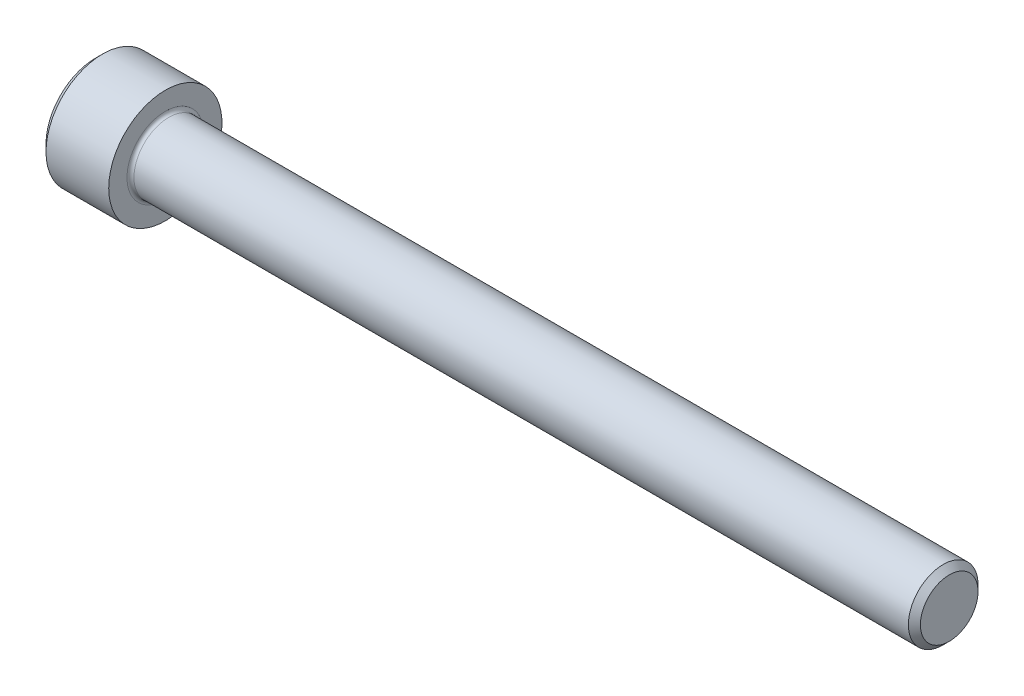
ISO-10303-21;
HEADER;
FILE_DESCRIPTION(('STEP AP214'),'2;1');
FILE_NAME('part.step','',(''),(''),'','','');
FILE_SCHEMA(('AUTOMOTIVE_DESIGN { 1 0 10303 214 1 1 1 1 }'));
ENDSEC;
DATA;
#1=APPLICATION_CONTEXT('core data for automotive mechanical design processes');
#2=APPLICATION_PROTOCOL_DEFINITION('international standard','automotive_design',2000,#1);
#3=PRODUCT_CONTEXT('',#1,'mechanical');
#4=PRODUCT('Part','Part','',(#3));
#5=PRODUCT_RELATED_PRODUCT_CATEGORY('part','',(#4));
#6=PRODUCT_DEFINITION_FORMATION('','',#4);
#7=PRODUCT_DEFINITION_CONTEXT('part definition',#1,'design');
#8=PRODUCT_DEFINITION('design','',#6,#7);
#9=PRODUCT_DEFINITION_SHAPE('','',#8);
#10=(LENGTH_UNIT() NAMED_UNIT(*) SI_UNIT(.MILLI.,.METRE.));
#11=(NAMED_UNIT(*) PLANE_ANGLE_UNIT() SI_UNIT($,.RADIAN.));
#12=(NAMED_UNIT(*) SI_UNIT($,.STERADIAN.) SOLID_ANGLE_UNIT());
#13=UNCERTAINTY_MEASURE_WITH_UNIT(LENGTH_MEASURE(1.E-05),#10,'distance_accuracy_value','');
#14=(GEOMETRIC_REPRESENTATION_CONTEXT(3) GLOBAL_UNCERTAINTY_ASSIGNED_CONTEXT((#13)) GLOBAL_UNIT_ASSIGNED_CONTEXT((#10,
#11,#12)) REPRESENTATION_CONTEXT('',''));
#15=CARTESIAN_POINT('',(0.,0.,0.));
#16=DIRECTION('',(0.,0.,1.));
#17=DIRECTION('',(1.,0.,0.));
#18=AXIS2_PLACEMENT_3D('',#15,#16,#17);
#19=CARTESIAN_POINT('',(0.,0.,0.));
#20=DIRECTION('',(-1.,0.,0.));
#21=DIRECTION('',(0.,0.,1.));
#22=AXIS2_PLACEMENT_3D('',#19,#20,#21);
#23=PLANE('',#22);
#24=DIRECTION('',(0.,-0.499999999999999,0.866025403784439));
#25=VECTOR('',#24,1.);
#26=CARTESIAN_POINT('',(0.,3.51894989071077,0.));
#27=LINE('',#26,#25);
#28=CARTESIAN_POINT('',(0.,3.51894989071077,0.));
#29=VERTEX_POINT('',#28);
#30=CARTESIAN_POINT('',(0.,1.75947494535539,3.0475));
#31=VERTEX_POINT('',#30);
#32=EDGE_CURVE('E274',#29,#31,#27,.T.);
#33=ORIENTED_EDGE('',*,*,#32,.T.);
#34=DIRECTION('',(0.,1.,0.));
#35=VECTOR('',#34,1.);
#36=CARTESIAN_POINT('',(0.,-1.75947494535538,3.0475));
#37=LINE('',#36,#35);
#38=CARTESIAN_POINT('',(0.,-1.75947494535538,3.0475));
#39=VERTEX_POINT('',#38);
#40=EDGE_CURVE('E131',#39,#31,#37,.T.);
#41=ORIENTED_EDGE('',*,*,#40,.F.);
#42=DIRECTION('',(0.,-0.500000000000001,-0.866025403784438));
#43=VECTOR('',#42,1.);
#44=CARTESIAN_POINT('',(0.,-1.75947494535538,3.0475));
#45=LINE('',#44,#43);
#46=CARTESIAN_POINT('',(0.,-3.51894989071077,0.));
#47=VERTEX_POINT('',#46);
#48=EDGE_CURVE('E280',#39,#47,#45,.T.);
#49=ORIENTED_EDGE('',*,*,#48,.T.);
#50=DIRECTION('',(0.,0.499999999999999,-0.866025403784439));
#51=VECTOR('',#50,1.);
#52=CARTESIAN_POINT('',(0.,-3.51894989071077,0.));
#53=LINE('',#52,#51);
#54=CARTESIAN_POINT('',(0.,-1.75947494535539,-3.0475));
#55=VERTEX_POINT('',#54);
#56=EDGE_CURVE('E277',#47,#55,#53,.T.);
#57=ORIENTED_EDGE('',*,*,#56,.T.);
#58=DIRECTION('',(0.,-1.,0.));
#59=VECTOR('',#58,1.);
#60=CARTESIAN_POINT('',(0.,1.75947494535538,-3.0475));
#61=LINE('',#60,#59);
#62=CARTESIAN_POINT('',(0.,1.75947494535538,-3.0475));
#63=VERTEX_POINT('',#62);
#64=EDGE_CURVE('E281',#63,#55,#61,.T.);
#65=ORIENTED_EDGE('',*,*,#64,.F.);
#66=DIRECTION('',(0.,-0.500000000000001,-0.866025403784438));
#67=VECTOR('',#66,1.);
#68=CARTESIAN_POINT('',(0.,3.51894989071077,0.));
#69=LINE('',#68,#67);
#70=EDGE_CURVE('E126',#29,#63,#69,.T.);
#71=ORIENTED_EDGE('',*,*,#70,.F.);
#72=EDGE_LOOP('',(#33,#41,#49,#57,#65,#71));
#73=FACE_BOUND('',#72,.T.);
#74=CARTESIAN_POINT('',(0.,0.,0.));
#75=DIRECTION('',(-1.,0.,0.));
#76=DIRECTION('',(0.,0.,1.));
#77=AXIS2_PLACEMENT_3D('',#74,#75,#76);
#78=CIRCLE('',#77,5.7);
#79=CARTESIAN_POINT('',(0.,0.,5.7));
#80=VERTEX_POINT('',#79);
#81=EDGE_CURVE('E160',#80,#80,#78,.T.);
#82=ORIENTED_EDGE('',*,*,#81,.T.);
#83=EDGE_LOOP('',(#82));
#84=FACE_BOUND('',#83,.T.);
#85=ADVANCED_FACE('F41',(#73,#84),#23,.T.);
#86=CARTESIAN_POINT('',(0.,0.,0.));
#87=DIRECTION('',(1.,0.,0.));
#88=DIRECTION('',(0.,0.,-1.));
#89=AXIS2_PLACEMENT_3D('',#86,#87,#88);
#90=CONICAL_SURFACE('',#89,5.7,0.785398163397448);
#91=CARTESIAN_POINT('',(0.800000000000002,0.,0.));
#92=DIRECTION('',(-1.,0.,0.));
#93=DIRECTION('',(0.,0.,1.));
#94=AXIS2_PLACEMENT_3D('',#91,#92,#93);
#95=CIRCLE('',#94,6.5);
#96=CARTESIAN_POINT('',(0.800000000000002,0.,6.5));
#97=VERTEX_POINT('',#96);
#98=EDGE_CURVE('E154',#97,#97,#95,.T.);
#99=ORIENTED_EDGE('',*,*,#98,.T.);
#100=EDGE_LOOP('',(#99));
#101=FACE_BOUND('',#100,.T.);
#102=ORIENTED_EDGE('',*,*,#81,.F.);
#103=EDGE_LOOP('',(#102));
#104=FACE_BOUND('',#103,.T.);
#105=ADVANCED_FACE('F177',(#101,#104),#90,.T.);
#106=CARTESIAN_POINT('',(-31.75,0.,0.));
#107=DIRECTION('',(-1.,0.,0.));
#108=DIRECTION('',(0.,0.,1.));
#109=AXIS2_PLACEMENT_3D('',#106,#107,#108);
#110=CYLINDRICAL_SURFACE('',#109,6.5);
#111=CARTESIAN_POINT('',(7.99999999999999,0.,0.));
#112=DIRECTION('',(-1.,0.,0.));
#113=DIRECTION('',(0.,0.,1.));
#114=AXIS2_PLACEMENT_3D('',#111,#112,#113);
#115=CIRCLE('',#114,6.5);
#116=CARTESIAN_POINT('',(7.99999999999999,0.,6.5));
#117=VERTEX_POINT('',#116);
#118=EDGE_CURVE('E153',#117,#117,#115,.T.);
#119=ORIENTED_EDGE('',*,*,#118,.T.);
#120=EDGE_LOOP('',(#119));
#121=FACE_BOUND('',#120,.T.);
#122=ORIENTED_EDGE('',*,*,#98,.F.);
#123=EDGE_LOOP('',(#122));
#124=FACE_BOUND('',#123,.T.);
#125=ADVANCED_FACE('F183',(#121,#124),#110,.T.);
#126=CARTESIAN_POINT('',(8.,6.5,0.));
#127=DIRECTION('',(1.,0.,0.));
#128=DIRECTION('',(0.,0.,-1.));
#129=AXIS2_PLACEMENT_3D('',#126,#127,#128);
#130=PLANE('',#129);
#131=CARTESIAN_POINT('',(8.,0.,0.));
#132=DIRECTION('',(1.,0.,0.));
#133=DIRECTION('',(0.,0.,-1.));
#134=AXIS2_PLACEMENT_3D('',#131,#132,#133);
#135=CIRCLE('',#134,4.40000000000003);
#136=CARTESIAN_POINT('',(8.,0.,-4.40000000000003));
#137=VERTEX_POINT('',#136);
#138=EDGE_CURVE('E47',#137,#137,#135,.F.);
#139=ORIENTED_EDGE('',*,*,#138,.T.);
#140=EDGE_LOOP('',(#139));
#141=FACE_BOUND('',#140,.T.);
#142=ORIENTED_EDGE('',*,*,#118,.F.);
#143=EDGE_LOOP('',(#142));
#144=FACE_BOUND('',#143,.T.);
#145=ADVANCED_FACE('F162',(#141,#144),#130,.T.);
#146=CARTESIAN_POINT('',(-31.75,0.,0.));
#147=DIRECTION('',(-1.,0.,0.));
#148=DIRECTION('',(0.,0.,1.));
#149=AXIS2_PLACEMENT_3D('',#146,#147,#148);
#150=CYLINDRICAL_SURFACE('',#149,4.00000000000003);
#151=CARTESIAN_POINT('',(8.4,0.,0.));
#152=DIRECTION('',(1.,0.,0.));
#153=DIRECTION('',(0.,0.,-1.));
#154=AXIS2_PLACEMENT_3D('',#151,#152,#153);
#155=CIRCLE('',#154,4.00000000000003);
#156=CARTESIAN_POINT('',(8.4,0.,-4.00000000000003));
#157=VERTEX_POINT('',#156);
#158=EDGE_CURVE('E11',#157,#157,#155,.T.);
#159=ORIENTED_EDGE('',*,*,#158,.T.);
#160=EDGE_LOOP('',(#159));
#161=FACE_BOUND('',#160,.T.);
#162=CARTESIAN_POINT('',(97.3095000000001,0.,0.));
#163=DIRECTION('',(-1.,0.,0.));
#164=DIRECTION('',(0.,0.,1.));
#165=AXIS2_PLACEMENT_3D('',#162,#163,#164);
#166=CIRCLE('',#165,4.00000000000006);
#167=CARTESIAN_POINT('',(97.3095000000001,0.,4.00000000000006));
#168=VERTEX_POINT('',#167);
#169=EDGE_CURVE('E146',#168,#168,#166,.T.);
#170=ORIENTED_EDGE('',*,*,#169,.T.);
#171=EDGE_LOOP('',(#170));
#172=FACE_BOUND('',#171,.T.);
#173=ADVANCED_FACE('F194',(#161,#172),#150,.T.);
#174=CARTESIAN_POINT('',(98.,0.,0.));
#175=DIRECTION('',(-1.,0.,0.));
#176=DIRECTION('',(0.,0.,1.));
#177=AXIS2_PLACEMENT_3D('',#174,#175,#176);
#178=CONICAL_SURFACE('',#177,3.3095,0.785398163397563);
#179=ORIENTED_EDGE('',*,*,#169,.F.);
#180=EDGE_LOOP('',(#179));
#181=FACE_BOUND('',#180,.T.);
#182=CARTESIAN_POINT('',(98.,0.,0.));
#183=DIRECTION('',(-1.,0.,0.));
#184=DIRECTION('',(0.,0.,1.));
#185=AXIS2_PLACEMENT_3D('',#182,#183,#184);
#186=CIRCLE('',#185,3.3095);
#187=CARTESIAN_POINT('',(98.,0.,3.3095));
#188=VERTEX_POINT('',#187);
#189=EDGE_CURVE('E144',#188,#188,#186,.T.);
#190=ORIENTED_EDGE('',*,*,#189,.T.);
#191=EDGE_LOOP('',(#190));
#192=FACE_BOUND('',#191,.T.);
#193=ADVANCED_FACE('F174',(#181,#192),#178,.T.);
#194=CARTESIAN_POINT('',(98.,3.3095,0.));
#195=DIRECTION('',(1.,0.,0.));
#196=DIRECTION('',(0.,0.,-1.));
#197=AXIS2_PLACEMENT_3D('',#194,#195,#196);
#198=PLANE('',#197);
#199=ORIENTED_EDGE('',*,*,#189,.F.);
#200=EDGE_LOOP('',(#199));
#201=FACE_BOUND('',#200,.T.);
#202=ADVANCED_FACE('F168',(#201),#198,.T.);
#203=CARTESIAN_POINT('',(8.4,0.,0.));
#204=DIRECTION('',(1.,0.,0.));
#205=DIRECTION('',(0.,0.,-1.));
#206=AXIS2_PLACEMENT_3D('',#203,#204,#205);
#207=TOROIDAL_SURFACE('',#206,4.40000000000003,0.4);
#208=ORIENTED_EDGE('',*,*,#158,.F.);
#209=EDGE_LOOP('',(#208));
#210=FACE_BOUND('',#209,.T.);
#211=ORIENTED_EDGE('',*,*,#138,.F.);
#212=EDGE_LOOP('',(#211));
#213=FACE_BOUND('',#212,.T.);
#214=ADVANCED_FACE('F43',(#210,#213),#207,.F.);
#215=CARTESIAN_POINT('',(4.,3.51894989071077,0.));
#216=DIRECTION('',(0.,-0.866025403784439,-0.499999999999999));
#217=DIRECTION('',(0.,0.499999999999999,-0.866025403784439));
#218=AXIS2_PLACEMENT_3D('',#215,#216,#217);
#219=PLANE('',#218);
#220=ORIENTED_EDGE('',*,*,#32,.F.);
#221=DIRECTION('',(-1.,0.,0.));
#222=VECTOR('',#221,1.);
#223=CARTESIAN_POINT('',(4.,3.51894989071077,0.));
#224=LINE('',#223,#222);
#225=CARTESIAN_POINT('',(4.,3.51894989071077,0.));
#226=VERTEX_POINT('',#225);
#227=EDGE_CURVE('E271',#226,#29,#224,.T.);
#228=ORIENTED_EDGE('',*,*,#227,.F.);
#229=DIRECTION('',(0.,-0.499999999999999,0.866025403784439));
#230=VECTOR('',#229,1.);
#231=CARTESIAN_POINT('',(4.,3.51894989071077,0.));
#232=LINE('',#231,#230);
#233=CARTESIAN_POINT('',(3.99999999999999,2.63921241803308,1.52375));
#234=VERTEX_POINT('',#233);
#235=EDGE_CURVE('E57',#226,#234,#232,.T.);
#236=ORIENTED_EDGE('',*,*,#235,.T.);
#237=CARTESIAN_POINT('',(4.,1.75947494535539,3.0475));
#238=VERTEX_POINT('',#237);
#239=EDGE_CURVE('E112',#234,#238,#232,.T.);
#240=ORIENTED_EDGE('',*,*,#239,.T.);
#241=DIRECTION('',(-1.,0.,0.));
#242=VECTOR('',#241,1.);
#243=CARTESIAN_POINT('',(4.,1.75947494535539,3.0475));
#244=LINE('',#243,#242);
#245=EDGE_CURVE('E128',#238,#31,#244,.T.);
#246=ORIENTED_EDGE('',*,*,#245,.T.);
#247=EDGE_LOOP('',(#220,#228,#236,#240,#246));
#248=FACE_BOUND('',#247,.T.);
#249=ADVANCED_FACE('F123',(#248),#219,.T.);
#250=CARTESIAN_POINT('',(4.,-1.75947494535538,3.0475));
#251=DIRECTION('',(0.,0.,1.));
#252=DIRECTION('',(0.,-1.,0.));
#253=AXIS2_PLACEMENT_3D('',#250,#251,#252);
#254=PLANE('',#253);
#255=ORIENTED_EDGE('',*,*,#40,.T.);
#256=ORIENTED_EDGE('',*,*,#245,.F.);
#257=DIRECTION('',(0.,1.,0.));
#258=VECTOR('',#257,1.);
#259=CARTESIAN_POINT('',(4.,-1.75947494535538,3.0475));
#260=LINE('',#259,#258);
#261=CARTESIAN_POINT('',(4.,0.,3.0475));
#262=VERTEX_POINT('',#261);
#263=EDGE_CURVE('E115',#262,#238,#260,.T.);
#264=ORIENTED_EDGE('',*,*,#263,.F.);
#265=CARTESIAN_POINT('',(4.,-1.75947494535538,3.0475));
#266=VERTEX_POINT('',#265);
#267=EDGE_CURVE('E125',#266,#262,#260,.T.);
#268=ORIENTED_EDGE('',*,*,#267,.F.);
#269=DIRECTION('',(-1.,0.,0.));
#270=VECTOR('',#269,1.);
#271=CARTESIAN_POINT('',(4.,-1.75947494535538,3.0475));
#272=LINE('',#271,#270);
#273=EDGE_CURVE('E132',#266,#39,#272,.T.);
#274=ORIENTED_EDGE('',*,*,#273,.T.);
#275=EDGE_LOOP('',(#255,#256,#264,#268,#274));
#276=FACE_BOUND('',#275,.T.);
#277=ADVANCED_FACE('F127',(#276),#254,.F.);
#278=CARTESIAN_POINT('',(4.,-1.75947494535538,3.0475));
#279=DIRECTION('',(0.,0.866025403784438,-0.500000000000001));
#280=DIRECTION('',(0.,0.500000000000001,0.866025403784438));
#281=AXIS2_PLACEMENT_3D('',#278,#279,#280);
#282=PLANE('',#281);
#283=ORIENTED_EDGE('',*,*,#48,.F.);
#284=ORIENTED_EDGE('',*,*,#273,.F.);
#285=DIRECTION('',(0.,-0.500000000000001,-0.866025403784438));
#286=VECTOR('',#285,1.);
#287=CARTESIAN_POINT('',(4.,-1.75947494535538,3.0475));
#288=LINE('',#287,#286);
#289=CARTESIAN_POINT('',(4.,-2.63921241803307,1.52375));
#290=VERTEX_POINT('',#289);
#291=EDGE_CURVE('E251',#266,#290,#288,.T.);
#292=ORIENTED_EDGE('',*,*,#291,.T.);
#293=CARTESIAN_POINT('',(4.,-3.51894989071077,0.));
#294=VERTEX_POINT('',#293);
#295=EDGE_CURVE('E258',#290,#294,#288,.T.);
#296=ORIENTED_EDGE('',*,*,#295,.T.);
#297=DIRECTION('',(-1.,0.,0.));
#298=VECTOR('',#297,1.);
#299=CARTESIAN_POINT('',(4.,-3.51894989071077,0.));
#300=LINE('',#299,#298);
#301=EDGE_CURVE('E139',#294,#47,#300,.T.);
#302=ORIENTED_EDGE('',*,*,#301,.T.);
#303=EDGE_LOOP('',(#283,#284,#292,#296,#302));
#304=FACE_BOUND('',#303,.T.);
#305=ADVANCED_FACE('F207',(#304),#282,.T.);
#306=CARTESIAN_POINT('',(4.,-3.51894989071077,0.));
#307=DIRECTION('',(0.,0.866025403784439,0.499999999999999));
#308=DIRECTION('',(0.,-0.499999999999999,0.866025403784439));
#309=AXIS2_PLACEMENT_3D('',#306,#307,#308);
#310=PLANE('',#309);
#311=ORIENTED_EDGE('',*,*,#56,.F.);
#312=ORIENTED_EDGE('',*,*,#301,.F.);
#313=DIRECTION('',(0.,0.499999999999999,-0.866025403784439));
#314=VECTOR('',#313,1.);
#315=CARTESIAN_POINT('',(4.,-3.51894989071077,0.));
#316=LINE('',#315,#314);
#317=CARTESIAN_POINT('',(4.,-2.63921241803308,-1.52375));
#318=VERTEX_POINT('',#317);
#319=EDGE_CURVE('E259',#294,#318,#316,.T.);
#320=ORIENTED_EDGE('',*,*,#319,.T.);
#321=CARTESIAN_POINT('',(4.,-1.75947494535539,-3.0475));
#322=VERTEX_POINT('',#321);
#323=EDGE_CURVE('E261',#318,#322,#316,.T.);
#324=ORIENTED_EDGE('',*,*,#323,.T.);
#325=DIRECTION('',(-1.,0.,0.));
#326=VECTOR('',#325,1.);
#327=CARTESIAN_POINT('',(4.,-1.75947494535539,-3.0475));
#328=LINE('',#327,#326);
#329=EDGE_CURVE('E292',#322,#55,#328,.T.);
#330=ORIENTED_EDGE('',*,*,#329,.T.);
#331=EDGE_LOOP('',(#311,#312,#320,#324,#330));
#332=FACE_BOUND('',#331,.T.);
#333=ADVANCED_FACE('F209',(#332),#310,.T.);
#334=CARTESIAN_POINT('',(4.,1.75947494535538,-3.0475));
#335=DIRECTION('',(0.,0.,-1.));
#336=DIRECTION('',(0.,1.,0.));
#337=AXIS2_PLACEMENT_3D('',#334,#335,#336);
#338=PLANE('',#337);
#339=ORIENTED_EDGE('',*,*,#64,.T.);
#340=ORIENTED_EDGE('',*,*,#329,.F.);
#341=DIRECTION('',(0.,-1.,0.));
#342=VECTOR('',#341,1.);
#343=CARTESIAN_POINT('',(4.,1.75947494535538,-3.0475));
#344=LINE('',#343,#342);
#345=CARTESIAN_POINT('',(4.,0.,-3.0475));
#346=VERTEX_POINT('',#345);
#347=EDGE_CURVE('E270',#346,#322,#344,.T.);
#348=ORIENTED_EDGE('',*,*,#347,.F.);
#349=CARTESIAN_POINT('',(4.,1.75947494535538,-3.0475));
#350=VERTEX_POINT('',#349);
#351=EDGE_CURVE('E267',#350,#346,#344,.T.);
#352=ORIENTED_EDGE('',*,*,#351,.F.);
#353=DIRECTION('',(-1.,0.,0.));
#354=VECTOR('',#353,1.);
#355=CARTESIAN_POINT('',(4.,1.75947494535538,-3.0475));
#356=LINE('',#355,#354);
#357=EDGE_CURVE('E288',#350,#63,#356,.T.);
#358=ORIENTED_EDGE('',*,*,#357,.T.);
#359=EDGE_LOOP('',(#339,#340,#348,#352,#358));
#360=FACE_BOUND('',#359,.T.);
#361=ADVANCED_FACE('F211',(#360),#338,.F.);
#362=CARTESIAN_POINT('',(4.,3.51894989071077,0.));
#363=DIRECTION('',(0.,0.866025403784438,-0.500000000000001));
#364=DIRECTION('',(0.,0.500000000000001,0.866025403784438));
#365=AXIS2_PLACEMENT_3D('',#362,#363,#364);
#366=PLANE('',#365);
#367=ORIENTED_EDGE('',*,*,#70,.T.);
#368=ORIENTED_EDGE('',*,*,#357,.F.);
#369=DIRECTION('',(0.,-0.500000000000001,-0.866025403784438));
#370=VECTOR('',#369,1.);
#371=CARTESIAN_POINT('',(4.,3.51894989071077,0.));
#372=LINE('',#371,#370);
#373=CARTESIAN_POINT('',(4.,2.63921241803308,-1.52375));
#374=VERTEX_POINT('',#373);
#375=EDGE_CURVE('E272',#374,#350,#372,.T.);
#376=ORIENTED_EDGE('',*,*,#375,.F.);
#377=EDGE_CURVE('E244',#226,#374,#372,.T.);
#378=ORIENTED_EDGE('',*,*,#377,.F.);
#379=ORIENTED_EDGE('',*,*,#227,.T.);
#380=EDGE_LOOP('',(#367,#368,#376,#378,#379));
#381=FACE_BOUND('',#380,.T.);
#382=ADVANCED_FACE('F220',(#381),#366,.F.);
#383=CARTESIAN_POINT('',(4.,1.75947494535539,3.0475));
#384=DIRECTION('',(-1.,0.,0.));
#385=DIRECTION('',(0.,0.,1.));
#386=AXIS2_PLACEMENT_3D('',#383,#384,#385);
#387=PLANE('',#386);
#388=CARTESIAN_POINT('',(3.99999999999999,0.,0.));
#389=DIRECTION('',(-1.,0.,0.));
#390=DIRECTION('',(0.,0.,1.));
#391=AXIS2_PLACEMENT_3D('',#388,#389,#390);
#392=CIRCLE('',#391,3.0475);
#393=EDGE_CURVE('E134',#290,#262,#392,.T.);
#394=ORIENTED_EDGE('',*,*,#393,.F.);
#395=ORIENTED_EDGE('',*,*,#291,.F.);
#396=ORIENTED_EDGE('',*,*,#267,.T.);
#397=EDGE_LOOP('',(#394,#395,#396));
#398=FACE_BOUND('',#397,.T.);
#399=ADVANCED_FACE('F221',(#398),#387,.T.);
#400=EDGE_CURVE('E137',#318,#290,#392,.T.);
#401=ORIENTED_EDGE('',*,*,#400,.F.);
#402=ORIENTED_EDGE('',*,*,#319,.F.);
#403=ORIENTED_EDGE('',*,*,#295,.F.);
#404=EDGE_LOOP('',(#401,#402,#403));
#405=FACE_BOUND('',#404,.T.);
#406=ADVANCED_FACE('F223',(#405),#387,.T.);
#407=EDGE_CURVE('E296',#346,#318,#392,.T.);
#408=ORIENTED_EDGE('',*,*,#407,.F.);
#409=ORIENTED_EDGE('',*,*,#347,.T.);
#410=ORIENTED_EDGE('',*,*,#323,.F.);
#411=EDGE_LOOP('',(#408,#409,#410));
#412=FACE_BOUND('',#411,.T.);
#413=ADVANCED_FACE('F230',(#412),#387,.T.);
#414=EDGE_CURVE('E247',#374,#346,#392,.T.);
#415=ORIENTED_EDGE('',*,*,#414,.F.);
#416=ORIENTED_EDGE('',*,*,#375,.T.);
#417=ORIENTED_EDGE('',*,*,#351,.T.);
#418=EDGE_LOOP('',(#415,#416,#417));
#419=FACE_BOUND('',#418,.T.);
#420=ADVANCED_FACE('F236',(#419),#387,.T.);
#421=EDGE_CURVE('E143',#234,#374,#392,.T.);
#422=ORIENTED_EDGE('',*,*,#421,.F.);
#423=ORIENTED_EDGE('',*,*,#235,.F.);
#424=ORIENTED_EDGE('',*,*,#377,.T.);
#425=EDGE_LOOP('',(#422,#423,#424));
#426=FACE_BOUND('',#425,.T.);
#427=ADVANCED_FACE('F235',(#426),#387,.T.);
#428=EDGE_CURVE('E120',#262,#234,#392,.T.);
#429=ORIENTED_EDGE('',*,*,#428,.F.);
#430=ORIENTED_EDGE('',*,*,#263,.T.);
#431=ORIENTED_EDGE('',*,*,#239,.F.);
#432=EDGE_LOOP('',(#429,#430,#431));
#433=FACE_BOUND('',#432,.T.);
#434=ADVANCED_FACE('F113',(#433),#387,.T.);
#435=CARTESIAN_POINT('',(3.99999999999999,0.,0.));
#436=DIRECTION('',(-1.,0.,0.));
#437=DIRECTION('',(0.,0.,1.));
#438=AXIS2_PLACEMENT_3D('',#435,#436,#437);
#439=CONICAL_SURFACE('',#438,3.0475,1.04719755119659);
#440=CARTESIAN_POINT('',(5.75947494535539,0.,0.));
#441=VERTEX_POINT('',#440);
#442=VERTEX_LOOP('',#441);
#443=FACE_BOUND('',#442,.T.);
#444=ORIENTED_EDGE('',*,*,#428,.T.);
#445=ORIENTED_EDGE('',*,*,#421,.T.);
#446=ORIENTED_EDGE('',*,*,#414,.T.);
#447=ORIENTED_EDGE('',*,*,#407,.T.);
#448=ORIENTED_EDGE('',*,*,#400,.T.);
#449=ORIENTED_EDGE('',*,*,#393,.T.);
#450=EDGE_LOOP('',(#444,#445,#446,#447,#448,#449));
#451=FACE_BOUND('',#450,.T.);
#452=ADVANCED_FACE('F201',(#443,#451),#439,.F.);
#453=CLOSED_SHELL('',(#85,#105,#125,#145,#173,#193,#202,#214,#249,#277,#305,#333,#361,#382,#399,
#406,#413,#420,#427,#434,#452));
#454=MANIFOLD_SOLID_BREP('B2',#453);
#455=ADVANCED_BREP_SHAPE_REPRESENTATION('',(#18,#454),#14);
#456=SHAPE_DEFINITION_REPRESENTATION(#9,#455);
ENDSEC;
END-ISO-10303-21;
